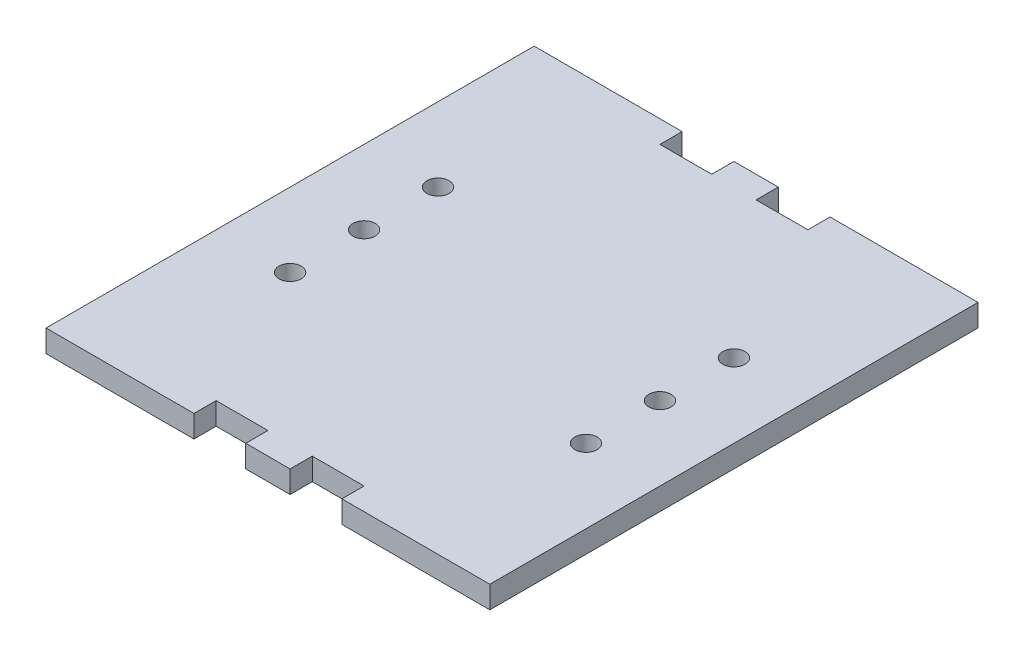
ISO-10303-21;
HEADER;
FILE_DESCRIPTION(('STEP AP214'),'2;1');
FILE_NAME('part.step','',(''),(''),'','','');
FILE_SCHEMA(('AUTOMOTIVE_DESIGN { 1 0 10303 214 1 1 1 1 }'));
ENDSEC;
DATA;
#1=APPLICATION_CONTEXT('core data for automotive mechanical design processes');
#2=APPLICATION_PROTOCOL_DEFINITION('international standard','automotive_design',2000,#1);
#3=PRODUCT_CONTEXT('',#1,'mechanical');
#4=PRODUCT('Part','Part','',(#3));
#5=PRODUCT_RELATED_PRODUCT_CATEGORY('part','',(#4));
#6=PRODUCT_DEFINITION_FORMATION('','',#4);
#7=PRODUCT_DEFINITION_CONTEXT('part definition',#1,'design');
#8=PRODUCT_DEFINITION('design','',#6,#7);
#9=PRODUCT_DEFINITION_SHAPE('','',#8);
#10=(LENGTH_UNIT() NAMED_UNIT(*) SI_UNIT(.MILLI.,.METRE.));
#11=(NAMED_UNIT(*) PLANE_ANGLE_UNIT() SI_UNIT($,.RADIAN.));
#12=(NAMED_UNIT(*) SI_UNIT($,.STERADIAN.) SOLID_ANGLE_UNIT());
#13=UNCERTAINTY_MEASURE_WITH_UNIT(LENGTH_MEASURE(1.E-05),#10,'distance_accuracy_value','');
#14=(GEOMETRIC_REPRESENTATION_CONTEXT(3) GLOBAL_UNCERTAINTY_ASSIGNED_CONTEXT((#13)) GLOBAL_UNIT_ASSIGNED_CONTEXT((#10,
#11,#12)) REPRESENTATION_CONTEXT('',''));
#15=CARTESIAN_POINT('',(0.,0.,0.));
#16=DIRECTION('',(0.,0.,1.));
#17=DIRECTION('',(1.,0.,0.));
#18=AXIS2_PLACEMENT_3D('',#15,#16,#17);
#19=CARTESIAN_POINT('',(0.,3.,0.));
#20=DIRECTION('',(0.,1.,0.));
#21=DIRECTION('',(0.,0.,1.));
#22=AXIS2_PLACEMENT_3D('',#19,#20,#21);
#23=PLANE('',#22);
#24=CARTESIAN_POINT('',(20.,3.,0.));
#25=DIRECTION('',(0.,1.,0.));
#26=DIRECTION('',(0.,0.,-1.));
#27=AXIS2_PLACEMENT_3D('',#24,#25,#26);
#28=CIRCLE('',#27,1.5);
#29=CARTESIAN_POINT('',(20.,3.,-1.5));
#30=VERTEX_POINT('',#29);
#31=EDGE_CURVE('E263',#30,#30,#28,.T.);
#32=ORIENTED_EDGE('',*,*,#31,.F.);
#33=EDGE_LOOP('',(#32));
#34=FACE_BOUND('',#33,.T.);
#35=CARTESIAN_POINT('',(-20.,3.,10.));
#36=DIRECTION('',(0.,1.,0.));
#37=DIRECTION('',(0.,0.,1.));
#38=AXIS2_PLACEMENT_3D('',#35,#36,#37);
#39=CIRCLE('',#38,1.5);
#40=CARTESIAN_POINT('',(-20.,3.,11.5));
#41=VERTEX_POINT('',#40);
#42=EDGE_CURVE('E247',#41,#41,#39,.T.);
#43=ORIENTED_EDGE('',*,*,#42,.F.);
#44=EDGE_LOOP('',(#43));
#45=FACE_BOUND('',#44,.T.);
#46=CARTESIAN_POINT('',(-20.,3.,0.));
#47=DIRECTION('',(0.,1.,0.));
#48=DIRECTION('',(0.,0.,1.));
#49=AXIS2_PLACEMENT_3D('',#46,#47,#48);
#50=CIRCLE('',#49,1.5);
#51=CARTESIAN_POINT('',(-20.,3.,1.5));
#52=VERTEX_POINT('',#51);
#53=EDGE_CURVE('E228',#52,#52,#50,.T.);
#54=ORIENTED_EDGE('',*,*,#53,.F.);
#55=EDGE_LOOP('',(#54));
#56=FACE_BOUND('',#55,.T.);
#57=CARTESIAN_POINT('',(-20.,3.,-9.99999999999999));
#58=DIRECTION('',(0.,1.,0.));
#59=DIRECTION('',(0.,0.,1.));
#60=AXIS2_PLACEMENT_3D('',#57,#58,#59);
#61=CIRCLE('',#60,1.5);
#62=CARTESIAN_POINT('',(-20.,3.,-8.49999999999999));
#63=VERTEX_POINT('',#62);
#64=EDGE_CURVE('E239',#63,#63,#61,.T.);
#65=ORIENTED_EDGE('',*,*,#64,.F.);
#66=EDGE_LOOP('',(#65));
#67=FACE_BOUND('',#66,.T.);
#68=CARTESIAN_POINT('',(20.,3.,10.));
#69=DIRECTION('',(0.,1.,0.));
#70=DIRECTION('',(0.,0.,-1.));
#71=AXIS2_PLACEMENT_3D('',#68,#69,#70);
#72=CIRCLE('',#71,1.5);
#73=CARTESIAN_POINT('',(20.,3.,8.50000000000001));
#74=VERTEX_POINT('',#73);
#75=EDGE_CURVE('E255',#74,#74,#72,.T.);
#76=ORIENTED_EDGE('',*,*,#75,.F.);
#77=EDGE_LOOP('',(#76));
#78=FACE_BOUND('',#77,.T.);
#79=CARTESIAN_POINT('',(20.,3.,-9.99999999999999));
#80=DIRECTION('',(0.,1.,0.));
#81=DIRECTION('',(0.,0.,-1.));
#82=AXIS2_PLACEMENT_3D('',#79,#80,#81);
#83=CIRCLE('',#82,1.5);
#84=CARTESIAN_POINT('',(20.,3.,-11.5));
#85=VERTEX_POINT('',#84);
#86=EDGE_CURVE('E271',#85,#85,#83,.T.);
#87=ORIENTED_EDGE('',*,*,#86,.F.);
#88=EDGE_LOOP('',(#87));
#89=FACE_BOUND('',#88,.T.);
#90=DIRECTION('',(-1.,0.,0.));
#91=VECTOR('',#90,1.);
#92=CARTESIAN_POINT('',(-3.,3.,-33.));
#93=LINE('',#92,#91);
#94=CARTESIAN_POINT('',(30.,3.,-33.));
#95=VERTEX_POINT('',#94);
#96=CARTESIAN_POINT('',(10.,3.,-33.));
#97=VERTEX_POINT('',#96);
#98=EDGE_CURVE('E214',#95,#97,#93,.T.);
#99=ORIENTED_EDGE('',*,*,#98,.T.);
#100=DIRECTION('',(0.,0.,1.));
#101=VECTOR('',#100,1.);
#102=CARTESIAN_POINT('',(10.,3.,0.));
#103=LINE('',#102,#101);
#104=CARTESIAN_POINT('',(10.,3.,-30.));
#105=VERTEX_POINT('',#104);
#106=EDGE_CURVE('E187',#97,#105,#103,.T.);
#107=ORIENTED_EDGE('',*,*,#106,.T.);
#108=DIRECTION('',(-1.,0.,0.));
#109=VECTOR('',#108,1.);
#110=CARTESIAN_POINT('',(0.,3.,-30.));
#111=LINE('',#110,#109);
#112=CARTESIAN_POINT('',(3.,3.,-30.));
#113=VERTEX_POINT('',#112);
#114=EDGE_CURVE('E201',#105,#113,#111,.T.);
#115=ORIENTED_EDGE('',*,*,#114,.T.);
#116=DIRECTION('',(0.,0.,-1.));
#117=VECTOR('',#116,1.);
#118=CARTESIAN_POINT('',(3.,3.,0.));
#119=LINE('',#118,#117);
#120=CARTESIAN_POINT('',(3.,3.,-33.));
#121=VERTEX_POINT('',#120);
#122=EDGE_CURVE('E434',#113,#121,#119,.T.);
#123=ORIENTED_EDGE('',*,*,#122,.T.);
#124=CARTESIAN_POINT('',(-3.,3.,-33.));
#125=VERTEX_POINT('',#124);
#126=EDGE_CURVE('E64',#121,#125,#93,.T.);
#127=ORIENTED_EDGE('',*,*,#126,.T.);
#128=DIRECTION('',(0.,0.,1.));
#129=VECTOR('',#128,1.);
#130=CARTESIAN_POINT('',(-3.,3.,0.));
#131=LINE('',#130,#129);
#132=CARTESIAN_POINT('',(-3.,3.,-30.));
#133=VERTEX_POINT('',#132);
#134=EDGE_CURVE('E409',#125,#133,#131,.T.);
#135=ORIENTED_EDGE('',*,*,#134,.T.);
#136=DIRECTION('',(-1.,0.,0.));
#137=VECTOR('',#136,1.);
#138=CARTESIAN_POINT('',(0.,3.,-30.));
#139=LINE('',#138,#137);
#140=CARTESIAN_POINT('',(-10.,3.,-30.));
#141=VERTEX_POINT('',#140);
#142=EDGE_CURVE('E412',#133,#141,#139,.T.);
#143=ORIENTED_EDGE('',*,*,#142,.T.);
#144=DIRECTION('',(0.,0.,-1.));
#145=VECTOR('',#144,1.);
#146=CARTESIAN_POINT('',(-10.,3.,0.));
#147=LINE('',#146,#145);
#148=CARTESIAN_POINT('',(-10.,3.,-33.));
#149=VERTEX_POINT('',#148);
#150=EDGE_CURVE('E404',#141,#149,#147,.T.);
#151=ORIENTED_EDGE('',*,*,#150,.T.);
#152=CARTESIAN_POINT('',(-30.,3.,-33.));
#153=VERTEX_POINT('',#152);
#154=EDGE_CURVE('E208',#149,#153,#93,.T.);
#155=ORIENTED_EDGE('',*,*,#154,.T.);
#156=DIRECTION('',(0.,0.,1.));
#157=VECTOR('',#156,1.);
#158=CARTESIAN_POINT('',(-30.,3.,-36.));
#159=LINE('',#158,#157);
#160=CARTESIAN_POINT('',(-30.,3.,33.));
#161=VERTEX_POINT('',#160);
#162=EDGE_CURVE('E48',#153,#161,#159,.T.);
#163=ORIENTED_EDGE('',*,*,#162,.T.);
#164=DIRECTION('',(-1.,0.,0.));
#165=VECTOR('',#164,1.);
#166=CARTESIAN_POINT('',(0.,3.,33.));
#167=LINE('',#166,#165);
#168=CARTESIAN_POINT('',(-10.,3.,33.));
#169=VERTEX_POINT('',#168);
#170=EDGE_CURVE('E318',#169,#161,#167,.T.);
#171=ORIENTED_EDGE('',*,*,#170,.F.);
#172=DIRECTION('',(0.,0.,1.));
#173=VECTOR('',#172,1.);
#174=CARTESIAN_POINT('',(-10.,3.,0.));
#175=LINE('',#174,#173);
#176=CARTESIAN_POINT('',(-10.,3.,30.));
#177=VERTEX_POINT('',#176);
#178=EDGE_CURVE('E322',#177,#169,#175,.T.);
#179=ORIENTED_EDGE('',*,*,#178,.F.);
#180=DIRECTION('',(-1.,0.,0.));
#181=VECTOR('',#180,1.);
#182=CARTESIAN_POINT('',(0.,3.,30.));
#183=LINE('',#182,#181);
#184=CARTESIAN_POINT('',(-3.,3.,30.));
#185=VERTEX_POINT('',#184);
#186=EDGE_CURVE('E326',#185,#177,#183,.T.);
#187=ORIENTED_EDGE('',*,*,#186,.F.);
#188=DIRECTION('',(0.,0.,-1.));
#189=VECTOR('',#188,1.);
#190=CARTESIAN_POINT('',(-3.,3.,0.));
#191=LINE('',#190,#189);
#192=CARTESIAN_POINT('',(-3.,3.,33.));
#193=VERTEX_POINT('',#192);
#194=EDGE_CURVE('E330',#193,#185,#191,.T.);
#195=ORIENTED_EDGE('',*,*,#194,.F.);
#196=DIRECTION('',(-1.,0.,0.));
#197=VECTOR('',#196,1.);
#198=CARTESIAN_POINT('',(0.,3.,33.));
#199=LINE('',#198,#197);
#200=CARTESIAN_POINT('',(3.,3.,33.));
#201=VERTEX_POINT('',#200);
#202=EDGE_CURVE('E334',#201,#193,#199,.T.);
#203=ORIENTED_EDGE('',*,*,#202,.F.);
#204=DIRECTION('',(0.,0.,1.));
#205=VECTOR('',#204,1.);
#206=CARTESIAN_POINT('',(3.,3.,0.));
#207=LINE('',#206,#205);
#208=CARTESIAN_POINT('',(3.,3.,30.));
#209=VERTEX_POINT('',#208);
#210=EDGE_CURVE('E338',#209,#201,#207,.T.);
#211=ORIENTED_EDGE('',*,*,#210,.F.);
#212=DIRECTION('',(-1.,0.,0.));
#213=VECTOR('',#212,1.);
#214=CARTESIAN_POINT('',(0.,3.,30.));
#215=LINE('',#214,#213);
#216=CARTESIAN_POINT('',(10.,3.,30.));
#217=VERTEX_POINT('',#216);
#218=EDGE_CURVE('E342',#217,#209,#215,.T.);
#219=ORIENTED_EDGE('',*,*,#218,.F.);
#220=DIRECTION('',(0.,0.,-1.));
#221=VECTOR('',#220,1.);
#222=CARTESIAN_POINT('',(10.,3.,0.));
#223=LINE('',#222,#221);
#224=CARTESIAN_POINT('',(10.,3.,33.));
#225=VERTEX_POINT('',#224);
#226=EDGE_CURVE('E346',#225,#217,#223,.T.);
#227=ORIENTED_EDGE('',*,*,#226,.F.);
#228=DIRECTION('',(-1.,0.,0.));
#229=VECTOR('',#228,1.);
#230=CARTESIAN_POINT('',(0.,3.,33.));
#231=LINE('',#230,#229);
#232=CARTESIAN_POINT('',(30.,3.,33.));
#233=VERTEX_POINT('',#232);
#234=EDGE_CURVE('E286',#233,#225,#231,.T.);
#235=ORIENTED_EDGE('',*,*,#234,.F.);
#236=DIRECTION('',(0.,0.,-1.));
#237=VECTOR('',#236,1.);
#238=CARTESIAN_POINT('',(30.,3.,-36.));
#239=LINE('',#238,#237);
#240=EDGE_CURVE('E11',#233,#95,#239,.T.);
#241=ORIENTED_EDGE('',*,*,#240,.T.);
#242=EDGE_LOOP('',(#99,#107,#115,#123,#127,#135,#143,#151,#155,#163,#171,#179,#187,#195,#203,
#211,#219,#227,#235,#241));
#243=FACE_BOUND('',#242,.T.);
#244=ADVANCED_FACE('F38',(#34,#45,#56,#67,#78,#89,#243),#23,.T.);
#245=CARTESIAN_POINT('',(0.,0.,0.));
#246=DIRECTION('',(0.,1.,0.));
#247=DIRECTION('',(0.,0.,1.));
#248=AXIS2_PLACEMENT_3D('',#245,#246,#247);
#249=PLANE('',#248);
#250=CARTESIAN_POINT('',(20.,0.,-9.99999999999999));
#251=DIRECTION('',(0.,1.,0.));
#252=DIRECTION('',(0.,0.,-1.));
#253=AXIS2_PLACEMENT_3D('',#250,#251,#252);
#254=CIRCLE('',#253,1.5);
#255=CARTESIAN_POINT('',(20.,0.,-11.5));
#256=VERTEX_POINT('',#255);
#257=EDGE_CURVE('E275',#256,#256,#254,.T.);
#258=ORIENTED_EDGE('',*,*,#257,.T.);
#259=EDGE_LOOP('',(#258));
#260=FACE_BOUND('',#259,.T.);
#261=CARTESIAN_POINT('',(20.,0.,0.));
#262=DIRECTION('',(0.,1.,0.));
#263=DIRECTION('',(0.,0.,-1.));
#264=AXIS2_PLACEMENT_3D('',#261,#262,#263);
#265=CIRCLE('',#264,1.5);
#266=CARTESIAN_POINT('',(20.,0.,-1.5));
#267=VERTEX_POINT('',#266);
#268=EDGE_CURVE('E267',#267,#267,#265,.T.);
#269=ORIENTED_EDGE('',*,*,#268,.T.);
#270=EDGE_LOOP('',(#269));
#271=FACE_BOUND('',#270,.T.);
#272=CARTESIAN_POINT('',(20.,0.,10.));
#273=DIRECTION('',(0.,1.,0.));
#274=DIRECTION('',(0.,0.,-1.));
#275=AXIS2_PLACEMENT_3D('',#272,#273,#274);
#276=CIRCLE('',#275,1.5);
#277=CARTESIAN_POINT('',(20.,0.,8.50000000000001));
#278=VERTEX_POINT('',#277);
#279=EDGE_CURVE('E259',#278,#278,#276,.T.);
#280=ORIENTED_EDGE('',*,*,#279,.T.);
#281=EDGE_LOOP('',(#280));
#282=FACE_BOUND('',#281,.T.);
#283=CARTESIAN_POINT('',(-20.,0.,10.));
#284=DIRECTION('',(0.,1.,0.));
#285=DIRECTION('',(0.,0.,1.));
#286=AXIS2_PLACEMENT_3D('',#283,#284,#285);
#287=CIRCLE('',#286,1.5);
#288=CARTESIAN_POINT('',(-20.,0.,11.5));
#289=VERTEX_POINT('',#288);
#290=EDGE_CURVE('E251',#289,#289,#287,.T.);
#291=ORIENTED_EDGE('',*,*,#290,.T.);
#292=EDGE_LOOP('',(#291));
#293=FACE_BOUND('',#292,.T.);
#294=CARTESIAN_POINT('',(-20.,0.,-9.99999999999999));
#295=DIRECTION('',(0.,1.,0.));
#296=DIRECTION('',(0.,0.,1.));
#297=AXIS2_PLACEMENT_3D('',#294,#295,#296);
#298=CIRCLE('',#297,1.5);
#299=CARTESIAN_POINT('',(-20.,0.,-8.49999999999999));
#300=VERTEX_POINT('',#299);
#301=EDGE_CURVE('E243',#300,#300,#298,.T.);
#302=ORIENTED_EDGE('',*,*,#301,.T.);
#303=EDGE_LOOP('',(#302));
#304=FACE_BOUND('',#303,.T.);
#305=CARTESIAN_POINT('',(-20.,0.,0.));
#306=DIRECTION('',(0.,1.,0.));
#307=DIRECTION('',(0.,0.,1.));
#308=AXIS2_PLACEMENT_3D('',#305,#306,#307);
#309=CIRCLE('',#308,1.5);
#310=CARTESIAN_POINT('',(-20.,0.,1.5));
#311=VERTEX_POINT('',#310);
#312=EDGE_CURVE('E235',#311,#311,#309,.T.);
#313=ORIENTED_EDGE('',*,*,#312,.T.);
#314=EDGE_LOOP('',(#313));
#315=FACE_BOUND('',#314,.T.);
#316=DIRECTION('',(0.,0.,1.));
#317=VECTOR('',#316,1.);
#318=CARTESIAN_POINT('',(10.,0.,0.));
#319=LINE('',#318,#317);
#320=CARTESIAN_POINT('',(10.,0.,-33.));
#321=VERTEX_POINT('',#320);
#322=CARTESIAN_POINT('',(10.,0.,-30.));
#323=VERTEX_POINT('',#322);
#324=EDGE_CURVE('E184',#321,#323,#319,.T.);
#325=ORIENTED_EDGE('',*,*,#324,.F.);
#326=DIRECTION('',(-1.,0.,0.));
#327=VECTOR('',#326,1.);
#328=CARTESIAN_POINT('',(3.,0.,-33.));
#329=LINE('',#328,#327);
#330=CARTESIAN_POINT('',(30.,0.,-33.));
#331=VERTEX_POINT('',#330);
#332=EDGE_CURVE('E42',#331,#321,#329,.T.);
#333=ORIENTED_EDGE('',*,*,#332,.F.);
#334=DIRECTION('',(0.,0.,-1.));
#335=VECTOR('',#334,1.);
#336=CARTESIAN_POINT('',(30.,0.,-36.));
#337=LINE('',#336,#335);
#338=CARTESIAN_POINT('',(30.,0.,33.));
#339=VERTEX_POINT('',#338);
#340=EDGE_CURVE('E216',#339,#331,#337,.T.);
#341=ORIENTED_EDGE('',*,*,#340,.F.);
#342=DIRECTION('',(-1.,0.,0.));
#343=VECTOR('',#342,1.);
#344=CARTESIAN_POINT('',(0.,0.,33.));
#345=LINE('',#344,#343);
#346=CARTESIAN_POINT('',(10.,0.,33.));
#347=VERTEX_POINT('',#346);
#348=EDGE_CURVE('E321',#339,#347,#345,.T.);
#349=ORIENTED_EDGE('',*,*,#348,.T.);
#350=DIRECTION('',(0.,0.,-1.));
#351=VECTOR('',#350,1.);
#352=CARTESIAN_POINT('',(10.,0.,0.));
#353=LINE('',#352,#351);
#354=CARTESIAN_POINT('',(10.,0.,30.));
#355=VERTEX_POINT('',#354);
#356=EDGE_CURVE('E380',#347,#355,#353,.T.);
#357=ORIENTED_EDGE('',*,*,#356,.T.);
#358=DIRECTION('',(-1.,0.,0.));
#359=VECTOR('',#358,1.);
#360=CARTESIAN_POINT('',(0.,0.,30.));
#361=LINE('',#360,#359);
#362=CARTESIAN_POINT('',(3.,0.,30.));
#363=VERTEX_POINT('',#362);
#364=EDGE_CURVE('E376',#355,#363,#361,.T.);
#365=ORIENTED_EDGE('',*,*,#364,.T.);
#366=DIRECTION('',(0.,0.,1.));
#367=VECTOR('',#366,1.);
#368=CARTESIAN_POINT('',(3.,0.,0.));
#369=LINE('',#368,#367);
#370=CARTESIAN_POINT('',(3.,0.,33.));
#371=VERTEX_POINT('',#370);
#372=EDGE_CURVE('E372',#363,#371,#369,.T.);
#373=ORIENTED_EDGE('',*,*,#372,.T.);
#374=DIRECTION('',(-1.,0.,0.));
#375=VECTOR('',#374,1.);
#376=CARTESIAN_POINT('',(0.,0.,33.));
#377=LINE('',#376,#375);
#378=CARTESIAN_POINT('',(-3.,0.,33.));
#379=VERTEX_POINT('',#378);
#380=EDGE_CURVE('E368',#371,#379,#377,.T.);
#381=ORIENTED_EDGE('',*,*,#380,.T.);
#382=DIRECTION('',(0.,0.,-1.));
#383=VECTOR('',#382,1.);
#384=CARTESIAN_POINT('',(-3.,0.,0.));
#385=LINE('',#384,#383);
#386=CARTESIAN_POINT('',(-3.,0.,30.));
#387=VERTEX_POINT('',#386);
#388=EDGE_CURVE('E364',#379,#387,#385,.T.);
#389=ORIENTED_EDGE('',*,*,#388,.T.);
#390=DIRECTION('',(-1.,0.,0.));
#391=VECTOR('',#390,1.);
#392=CARTESIAN_POINT('',(0.,0.,30.));
#393=LINE('',#392,#391);
#394=CARTESIAN_POINT('',(-10.,0.,30.));
#395=VERTEX_POINT('',#394);
#396=EDGE_CURVE('E360',#387,#395,#393,.T.);
#397=ORIENTED_EDGE('',*,*,#396,.T.);
#398=DIRECTION('',(0.,0.,1.));
#399=VECTOR('',#398,1.);
#400=CARTESIAN_POINT('',(-10.,0.,0.));
#401=LINE('',#400,#399);
#402=CARTESIAN_POINT('',(-10.,0.,33.));
#403=VERTEX_POINT('',#402);
#404=EDGE_CURVE('E356',#395,#403,#401,.T.);
#405=ORIENTED_EDGE('',*,*,#404,.T.);
#406=DIRECTION('',(-1.,0.,0.));
#407=VECTOR('',#406,1.);
#408=CARTESIAN_POINT('',(0.,0.,33.));
#409=LINE('',#408,#407);
#410=CARTESIAN_POINT('',(-30.,0.,33.));
#411=VERTEX_POINT('',#410);
#412=EDGE_CURVE('E291',#403,#411,#409,.T.);
#413=ORIENTED_EDGE('',*,*,#412,.T.);
#414=DIRECTION('',(0.,0.,1.));
#415=VECTOR('',#414,1.);
#416=CARTESIAN_POINT('',(-30.,0.,-36.));
#417=LINE('',#416,#415);
#418=CARTESIAN_POINT('',(-30.,0.,-33.));
#419=VERTEX_POINT('',#418);
#420=EDGE_CURVE('E223',#419,#411,#417,.T.);
#421=ORIENTED_EDGE('',*,*,#420,.F.);
#422=CARTESIAN_POINT('',(-10.,0.,-33.));
#423=VERTEX_POINT('',#422);
#424=EDGE_CURVE('E210',#423,#419,#329,.T.);
#425=ORIENTED_EDGE('',*,*,#424,.F.);
#426=DIRECTION('',(0.,0.,-1.));
#427=VECTOR('',#426,1.);
#428=CARTESIAN_POINT('',(-10.,0.,0.));
#429=LINE('',#428,#427);
#430=CARTESIAN_POINT('',(-10.,0.,-30.));
#431=VERTEX_POINT('',#430);
#432=EDGE_CURVE('E394',#431,#423,#429,.T.);
#433=ORIENTED_EDGE('',*,*,#432,.F.);
#434=DIRECTION('',(-1.,0.,0.));
#435=VECTOR('',#434,1.);
#436=CARTESIAN_POINT('',(0.,0.,-30.));
#437=LINE('',#436,#435);
#438=CARTESIAN_POINT('',(-3.,0.,-30.));
#439=VERTEX_POINT('',#438);
#440=EDGE_CURVE('E408',#439,#431,#437,.T.);
#441=ORIENTED_EDGE('',*,*,#440,.F.);
#442=DIRECTION('',(0.,0.,1.));
#443=VECTOR('',#442,1.);
#444=CARTESIAN_POINT('',(-3.,0.,0.));
#445=LINE('',#444,#443);
#446=CARTESIAN_POINT('',(-3.,0.,-33.));
#447=VERTEX_POINT('',#446);
#448=EDGE_CURVE('E419',#447,#439,#445,.T.);
#449=ORIENTED_EDGE('',*,*,#448,.F.);
#450=CARTESIAN_POINT('',(3.,0.,-33.));
#451=VERTEX_POINT('',#450);
#452=EDGE_CURVE('E209',#451,#447,#329,.T.);
#453=ORIENTED_EDGE('',*,*,#452,.F.);
#454=DIRECTION('',(0.,0.,-1.));
#455=VECTOR('',#454,1.);
#456=CARTESIAN_POINT('',(3.,0.,0.));
#457=LINE('',#456,#455);
#458=CARTESIAN_POINT('',(3.,0.,-30.));
#459=VERTEX_POINT('',#458);
#460=EDGE_CURVE('E56',#459,#451,#457,.T.);
#461=ORIENTED_EDGE('',*,*,#460,.F.);
#462=DIRECTION('',(-1.,0.,0.));
#463=VECTOR('',#462,1.);
#464=CARTESIAN_POINT('',(0.,0.,-30.));
#465=LINE('',#464,#463);
#466=EDGE_CURVE('E193',#323,#459,#465,.T.);
#467=ORIENTED_EDGE('',*,*,#466,.F.);
#468=EDGE_LOOP('',(#325,#333,#341,#349,#357,#365,#373,#381,#389,#397,#405,#413,#421,#425,#433,
#441,#449,#453,#461,#467));
#469=FACE_BOUND('',#468,.T.);
#470=ADVANCED_FACE('F197',(#260,#271,#282,#293,#304,#315,#469),#249,.F.);
#471=CARTESIAN_POINT('',(3.,3.,-33.));
#472=DIRECTION('',(0.,0.,1.));
#473=DIRECTION('',(1.,0.,0.));
#474=AXIS2_PLACEMENT_3D('',#471,#472,#473);
#475=PLANE('',#474);
#476=DIRECTION('',(0.,1.,0.));
#477=VECTOR('',#476,1.);
#478=CARTESIAN_POINT('',(10.,0.,-33.));
#479=LINE('',#478,#477);
#480=EDGE_CURVE('E180',#321,#97,#479,.T.);
#481=ORIENTED_EDGE('',*,*,#480,.T.);
#482=ORIENTED_EDGE('',*,*,#98,.F.);
#483=DIRECTION('',(0.,1.,0.));
#484=VECTOR('',#483,1.);
#485=CARTESIAN_POINT('',(30.,0.,-33.));
#486=LINE('',#485,#484);
#487=EDGE_CURVE('E205',#331,#95,#486,.T.);
#488=ORIENTED_EDGE('',*,*,#487,.F.);
#489=ORIENTED_EDGE('',*,*,#332,.T.);
#490=EDGE_LOOP('',(#481,#482,#488,#489));
#491=FACE_BOUND('',#490,.T.);
#492=ADVANCED_FACE('F203',(#491),#475,.F.);
#493=DIRECTION('',(0.,1.,0.));
#494=VECTOR('',#493,1.);
#495=CARTESIAN_POINT('',(3.,0.,-33.));
#496=LINE('',#495,#494);
#497=EDGE_CURVE('E192',#451,#121,#496,.T.);
#498=ORIENTED_EDGE('',*,*,#497,.F.);
#499=ORIENTED_EDGE('',*,*,#452,.T.);
#500=DIRECTION('',(0.,1.,0.));
#501=VECTOR('',#500,1.);
#502=CARTESIAN_POINT('',(-3.,0.,-33.));
#503=LINE('',#502,#501);
#504=EDGE_CURVE('E393',#447,#125,#503,.T.);
#505=ORIENTED_EDGE('',*,*,#504,.T.);
#506=ORIENTED_EDGE('',*,*,#126,.F.);
#507=EDGE_LOOP('',(#498,#499,#505,#506));
#508=FACE_BOUND('',#507,.T.);
#509=ADVANCED_FACE('F451',(#508),#475,.F.);
#510=DIRECTION('',(0.,1.,0.));
#511=VECTOR('',#510,1.);
#512=CARTESIAN_POINT('',(-10.,0.,-33.));
#513=LINE('',#512,#511);
#514=EDGE_CURVE('E398',#423,#149,#513,.T.);
#515=ORIENTED_EDGE('',*,*,#514,.F.);
#516=ORIENTED_EDGE('',*,*,#424,.T.);
#517=DIRECTION('',(0.,1.,0.));
#518=VECTOR('',#517,1.);
#519=CARTESIAN_POINT('',(-30.,0.,-33.));
#520=LINE('',#519,#518);
#521=EDGE_CURVE('E283',#419,#153,#520,.T.);
#522=ORIENTED_EDGE('',*,*,#521,.T.);
#523=ORIENTED_EDGE('',*,*,#154,.F.);
#524=EDGE_LOOP('',(#515,#516,#522,#523));
#525=FACE_BOUND('',#524,.T.);
#526=ADVANCED_FACE('F467',(#525),#475,.F.);
#527=CARTESIAN_POINT('',(-30.,3.,-36.));
#528=DIRECTION('',(1.,0.,0.));
#529=DIRECTION('',(0.,0.,-1.));
#530=AXIS2_PLACEMENT_3D('',#527,#528,#529);
#531=PLANE('',#530);
#532=ORIENTED_EDGE('',*,*,#420,.T.);
#533=DIRECTION('',(0.,1.,0.));
#534=VECTOR('',#533,1.);
#535=CARTESIAN_POINT('',(-30.,0.,33.));
#536=LINE('',#535,#534);
#537=EDGE_CURVE('E279',#411,#161,#536,.T.);
#538=ORIENTED_EDGE('',*,*,#537,.T.);
#539=ORIENTED_EDGE('',*,*,#162,.F.);
#540=ORIENTED_EDGE('',*,*,#521,.F.);
#541=EDGE_LOOP('',(#532,#538,#539,#540));
#542=FACE_BOUND('',#541,.T.);
#543=ADVANCED_FACE('F40',(#542),#531,.F.);
#544=CARTESIAN_POINT('',(30.,3.,-36.));
#545=DIRECTION('',(-1.,0.,0.));
#546=DIRECTION('',(0.,0.,1.));
#547=AXIS2_PLACEMENT_3D('',#544,#545,#546);
#548=PLANE('',#547);
#549=ORIENTED_EDGE('',*,*,#487,.T.);
#550=ORIENTED_EDGE('',*,*,#240,.F.);
#551=DIRECTION('',(0.,1.,0.));
#552=VECTOR('',#551,1.);
#553=CARTESIAN_POINT('',(30.,0.,33.));
#554=LINE('',#553,#552);
#555=EDGE_CURVE('E287',#339,#233,#554,.T.);
#556=ORIENTED_EDGE('',*,*,#555,.F.);
#557=ORIENTED_EDGE('',*,*,#340,.T.);
#558=EDGE_LOOP('',(#549,#550,#556,#557));
#559=FACE_BOUND('',#558,.T.);
#560=ADVANCED_FACE('F503',(#559),#548,.F.);
#561=CARTESIAN_POINT('',(-20.,3.,0.));
#562=DIRECTION('',(0.,-1.,0.));
#563=DIRECTION('',(0.,0.,-1.));
#564=AXIS2_PLACEMENT_3D('',#561,#562,#563);
#565=CYLINDRICAL_SURFACE('',#564,1.5);
#566=ORIENTED_EDGE('',*,*,#53,.T.);
#567=EDGE_LOOP('',(#566));
#568=FACE_BOUND('',#567,.T.);
#569=ORIENTED_EDGE('',*,*,#312,.F.);
#570=EDGE_LOOP('',(#569));
#571=FACE_BOUND('',#570,.T.);
#572=ADVANCED_FACE('F505',(#568,#571),#565,.F.);
#573=CARTESIAN_POINT('',(-20.,3.,-9.99999999999999));
#574=DIRECTION('',(0.,-1.,0.));
#575=DIRECTION('',(0.,0.,-1.));
#576=AXIS2_PLACEMENT_3D('',#573,#574,#575);
#577=CYLINDRICAL_SURFACE('',#576,1.5);
#578=ORIENTED_EDGE('',*,*,#64,.T.);
#579=EDGE_LOOP('',(#578));
#580=FACE_BOUND('',#579,.T.);
#581=ORIENTED_EDGE('',*,*,#301,.F.);
#582=EDGE_LOOP('',(#581));
#583=FACE_BOUND('',#582,.T.);
#584=ADVANCED_FACE('F511',(#580,#583),#577,.F.);
#585=CARTESIAN_POINT('',(-20.,3.,10.));
#586=DIRECTION('',(0.,-1.,0.));
#587=DIRECTION('',(0.,0.,-1.));
#588=AXIS2_PLACEMENT_3D('',#585,#586,#587);
#589=CYLINDRICAL_SURFACE('',#588,1.5);
#590=ORIENTED_EDGE('',*,*,#42,.T.);
#591=EDGE_LOOP('',(#590));
#592=FACE_BOUND('',#591,.T.);
#593=ORIENTED_EDGE('',*,*,#290,.F.);
#594=EDGE_LOOP('',(#593));
#595=FACE_BOUND('',#594,.T.);
#596=ADVANCED_FACE('F630',(#592,#595),#589,.F.);
#597=CARTESIAN_POINT('',(20.,3.,10.));
#598=DIRECTION('',(0.,-1.,0.));
#599=DIRECTION('',(0.,0.,-1.));
#600=AXIS2_PLACEMENT_3D('',#597,#598,#599);
#601=CYLINDRICAL_SURFACE('',#600,1.5);
#602=ORIENTED_EDGE('',*,*,#75,.T.);
#603=EDGE_LOOP('',(#602));
#604=FACE_BOUND('',#603,.T.);
#605=ORIENTED_EDGE('',*,*,#279,.F.);
#606=EDGE_LOOP('',(#605));
#607=FACE_BOUND('',#606,.T.);
#608=ADVANCED_FACE('F621',(#604,#607),#601,.F.);
#609=CARTESIAN_POINT('',(20.,3.,0.));
#610=DIRECTION('',(0.,-1.,0.));
#611=DIRECTION('',(0.,0.,-1.));
#612=AXIS2_PLACEMENT_3D('',#609,#610,#611);
#613=CYLINDRICAL_SURFACE('',#612,1.5);
#614=ORIENTED_EDGE('',*,*,#31,.T.);
#615=EDGE_LOOP('',(#614));
#616=FACE_BOUND('',#615,.T.);
#617=ORIENTED_EDGE('',*,*,#268,.F.);
#618=EDGE_LOOP('',(#617));
#619=FACE_BOUND('',#618,.T.);
#620=ADVANCED_FACE('F612',(#616,#619),#613,.F.);
#621=CARTESIAN_POINT('',(20.,3.,-9.99999999999999));
#622=DIRECTION('',(0.,-1.,0.));
#623=DIRECTION('',(0.,0.,-1.));
#624=AXIS2_PLACEMENT_3D('',#621,#622,#623);
#625=CYLINDRICAL_SURFACE('',#624,1.5);
#626=ORIENTED_EDGE('',*,*,#86,.T.);
#627=EDGE_LOOP('',(#626));
#628=FACE_BOUND('',#627,.T.);
#629=ORIENTED_EDGE('',*,*,#257,.F.);
#630=EDGE_LOOP('',(#629));
#631=FACE_BOUND('',#630,.T.);
#632=ADVANCED_FACE('F608',(#628,#631),#625,.F.);
#633=CARTESIAN_POINT('',(0.,0.,33.));
#634=DIRECTION('',(0.,0.,-1.));
#635=DIRECTION('',(-1.,0.,0.));
#636=AXIS2_PLACEMENT_3D('',#633,#634,#635);
#637=PLANE('',#636);
#638=ORIENTED_EDGE('',*,*,#170,.T.);
#639=ORIENTED_EDGE('',*,*,#537,.F.);
#640=ORIENTED_EDGE('',*,*,#412,.F.);
#641=DIRECTION('',(0.,1.,0.));
#642=VECTOR('',#641,1.);
#643=CARTESIAN_POINT('',(-10.,0.,33.));
#644=LINE('',#643,#642);
#645=EDGE_CURVE('E312',#403,#169,#644,.T.);
#646=ORIENTED_EDGE('',*,*,#645,.T.);
#647=EDGE_LOOP('',(#638,#639,#640,#646));
#648=FACE_BOUND('',#647,.T.);
#649=ADVANCED_FACE('F472',(#648),#637,.F.);
#650=CARTESIAN_POINT('',(-10.,0.,0.));
#651=DIRECTION('',(-1.,0.,0.));
#652=DIRECTION('',(0.,0.,1.));
#653=AXIS2_PLACEMENT_3D('',#650,#651,#652);
#654=PLANE('',#653);
#655=ORIENTED_EDGE('',*,*,#178,.T.);
#656=ORIENTED_EDGE('',*,*,#645,.F.);
#657=ORIENTED_EDGE('',*,*,#404,.F.);
#658=DIRECTION('',(0.,1.,0.));
#659=VECTOR('',#658,1.);
#660=CARTESIAN_POINT('',(-10.,0.,30.));
#661=LINE('',#660,#659);
#662=EDGE_CURVE('E309',#395,#177,#661,.T.);
#663=ORIENTED_EDGE('',*,*,#662,.T.);
#664=EDGE_LOOP('',(#655,#656,#657,#663));
#665=FACE_BOUND('',#664,.T.);
#666=ADVANCED_FACE('F475',(#665),#654,.F.);
#667=CARTESIAN_POINT('',(0.,0.,30.));
#668=DIRECTION('',(0.,0.,-1.));
#669=DIRECTION('',(-1.,0.,0.));
#670=AXIS2_PLACEMENT_3D('',#667,#668,#669);
#671=PLANE('',#670);
#672=ORIENTED_EDGE('',*,*,#186,.T.);
#673=ORIENTED_EDGE('',*,*,#662,.F.);
#674=ORIENTED_EDGE('',*,*,#396,.F.);
#675=DIRECTION('',(0.,1.,0.));
#676=VECTOR('',#675,1.);
#677=CARTESIAN_POINT('',(-3.,0.,30.));
#678=LINE('',#677,#676);
#679=EDGE_CURVE('E306',#387,#185,#678,.T.);
#680=ORIENTED_EDGE('',*,*,#679,.T.);
#681=EDGE_LOOP('',(#672,#673,#674,#680));
#682=FACE_BOUND('',#681,.T.);
#683=ADVANCED_FACE('F478',(#682),#671,.F.);
#684=CARTESIAN_POINT('',(-3.,0.,0.));
#685=DIRECTION('',(1.,0.,0.));
#686=DIRECTION('',(0.,0.,-1.));
#687=AXIS2_PLACEMENT_3D('',#684,#685,#686);
#688=PLANE('',#687);
#689=ORIENTED_EDGE('',*,*,#194,.T.);
#690=ORIENTED_EDGE('',*,*,#679,.F.);
#691=ORIENTED_EDGE('',*,*,#388,.F.);
#692=DIRECTION('',(0.,1.,0.));
#693=VECTOR('',#692,1.);
#694=CARTESIAN_POINT('',(-3.,0.,33.));
#695=LINE('',#694,#693);
#696=EDGE_CURVE('E303',#379,#193,#695,.T.);
#697=ORIENTED_EDGE('',*,*,#696,.T.);
#698=EDGE_LOOP('',(#689,#690,#691,#697));
#699=FACE_BOUND('',#698,.T.);
#700=ADVANCED_FACE('F483',(#699),#688,.F.);
#701=CARTESIAN_POINT('',(0.,0.,33.));
#702=DIRECTION('',(0.,0.,-1.));
#703=DIRECTION('',(-1.,0.,0.));
#704=AXIS2_PLACEMENT_3D('',#701,#702,#703);
#705=PLANE('',#704);
#706=ORIENTED_EDGE('',*,*,#202,.T.);
#707=ORIENTED_EDGE('',*,*,#696,.F.);
#708=ORIENTED_EDGE('',*,*,#380,.F.);
#709=DIRECTION('',(0.,1.,0.));
#710=VECTOR('',#709,1.);
#711=CARTESIAN_POINT('',(3.,0.,33.));
#712=LINE('',#711,#710);
#713=EDGE_CURVE('E300',#371,#201,#712,.T.);
#714=ORIENTED_EDGE('',*,*,#713,.T.);
#715=EDGE_LOOP('',(#706,#707,#708,#714));
#716=FACE_BOUND('',#715,.T.);
#717=ADVANCED_FACE('F487',(#716),#705,.F.);
#718=CARTESIAN_POINT('',(3.,0.,0.));
#719=DIRECTION('',(-1.,0.,0.));
#720=DIRECTION('',(0.,0.,1.));
#721=AXIS2_PLACEMENT_3D('',#718,#719,#720);
#722=PLANE('',#721);
#723=ORIENTED_EDGE('',*,*,#210,.T.);
#724=ORIENTED_EDGE('',*,*,#713,.F.);
#725=ORIENTED_EDGE('',*,*,#372,.F.);
#726=DIRECTION('',(0.,1.,0.));
#727=VECTOR('',#726,1.);
#728=CARTESIAN_POINT('',(3.,0.,30.));
#729=LINE('',#728,#727);
#730=EDGE_CURVE('E297',#363,#209,#729,.T.);
#731=ORIENTED_EDGE('',*,*,#730,.T.);
#732=EDGE_LOOP('',(#723,#724,#725,#731));
#733=FACE_BOUND('',#732,.T.);
#734=ADVANCED_FACE('F490',(#733),#722,.F.);
#735=CARTESIAN_POINT('',(0.,0.,30.));
#736=DIRECTION('',(0.,0.,-1.));
#737=DIRECTION('',(-1.,0.,0.));
#738=AXIS2_PLACEMENT_3D('',#735,#736,#737);
#739=PLANE('',#738);
#740=ORIENTED_EDGE('',*,*,#218,.T.);
#741=ORIENTED_EDGE('',*,*,#730,.F.);
#742=ORIENTED_EDGE('',*,*,#364,.F.);
#743=DIRECTION('',(0.,1.,0.));
#744=VECTOR('',#743,1.);
#745=CARTESIAN_POINT('',(10.,0.,30.));
#746=LINE('',#745,#744);
#747=EDGE_CURVE('E294',#355,#217,#746,.T.);
#748=ORIENTED_EDGE('',*,*,#747,.T.);
#749=EDGE_LOOP('',(#740,#741,#742,#748));
#750=FACE_BOUND('',#749,.T.);
#751=ADVANCED_FACE('F495',(#750),#739,.F.);
#752=CARTESIAN_POINT('',(10.,0.,0.));
#753=DIRECTION('',(1.,0.,0.));
#754=DIRECTION('',(0.,0.,-1.));
#755=AXIS2_PLACEMENT_3D('',#752,#753,#754);
#756=PLANE('',#755);
#757=ORIENTED_EDGE('',*,*,#226,.T.);
#758=ORIENTED_EDGE('',*,*,#747,.F.);
#759=ORIENTED_EDGE('',*,*,#356,.F.);
#760=DIRECTION('',(0.,1.,0.));
#761=VECTOR('',#760,1.);
#762=CARTESIAN_POINT('',(10.,0.,33.));
#763=LINE('',#762,#761);
#764=EDGE_CURVE('E290',#347,#225,#763,.T.);
#765=ORIENTED_EDGE('',*,*,#764,.T.);
#766=EDGE_LOOP('',(#757,#758,#759,#765));
#767=FACE_BOUND('',#766,.T.);
#768=ADVANCED_FACE('F499',(#767),#756,.F.);
#769=CARTESIAN_POINT('',(0.,0.,33.));
#770=DIRECTION('',(0.,0.,-1.));
#771=DIRECTION('',(-1.,0.,0.));
#772=AXIS2_PLACEMENT_3D('',#769,#770,#771);
#773=PLANE('',#772);
#774=ORIENTED_EDGE('',*,*,#234,.T.);
#775=ORIENTED_EDGE('',*,*,#764,.F.);
#776=ORIENTED_EDGE('',*,*,#348,.F.);
#777=ORIENTED_EDGE('',*,*,#555,.T.);
#778=EDGE_LOOP('',(#774,#775,#776,#777));
#779=FACE_BOUND('',#778,.T.);
#780=ADVANCED_FACE('F501',(#779),#773,.F.);
#781=CARTESIAN_POINT('',(0.,0.,-30.));
#782=DIRECTION('',(0.,0.,-1.));
#783=DIRECTION('',(-1.,0.,0.));
#784=AXIS2_PLACEMENT_3D('',#781,#782,#783);
#785=PLANE('',#784);
#786=ORIENTED_EDGE('',*,*,#142,.F.);
#787=DIRECTION('',(0.,1.,0.));
#788=VECTOR('',#787,1.);
#789=CARTESIAN_POINT('',(-3.,0.,-30.));
#790=LINE('',#789,#788);
#791=EDGE_CURVE('E390',#439,#133,#790,.T.);
#792=ORIENTED_EDGE('',*,*,#791,.F.);
#793=ORIENTED_EDGE('',*,*,#440,.T.);
#794=DIRECTION('',(0.,1.,0.));
#795=VECTOR('',#794,1.);
#796=CARTESIAN_POINT('',(-10.,0.,-30.));
#797=LINE('',#796,#795);
#798=EDGE_CURVE('E389',#431,#141,#797,.T.);
#799=ORIENTED_EDGE('',*,*,#798,.T.);
#800=EDGE_LOOP('',(#786,#792,#793,#799));
#801=FACE_BOUND('',#800,.T.);
#802=ADVANCED_FACE('F458',(#801),#785,.T.);
#803=CARTESIAN_POINT('',(-10.,0.,0.));
#804=DIRECTION('',(1.,0.,0.));
#805=DIRECTION('',(0.,0.,-1.));
#806=AXIS2_PLACEMENT_3D('',#803,#804,#805);
#807=PLANE('',#806);
#808=ORIENTED_EDGE('',*,*,#150,.F.);
#809=ORIENTED_EDGE('',*,*,#798,.F.);
#810=ORIENTED_EDGE('',*,*,#432,.T.);
#811=ORIENTED_EDGE('',*,*,#514,.T.);
#812=EDGE_LOOP('',(#808,#809,#810,#811));
#813=FACE_BOUND('',#812,.T.);
#814=ADVANCED_FACE('F462',(#813),#807,.T.);
#815=CARTESIAN_POINT('',(-3.,0.,0.));
#816=DIRECTION('',(-1.,0.,0.));
#817=DIRECTION('',(0.,0.,1.));
#818=AXIS2_PLACEMENT_3D('',#815,#816,#817);
#819=PLANE('',#818);
#820=ORIENTED_EDGE('',*,*,#134,.F.);
#821=ORIENTED_EDGE('',*,*,#504,.F.);
#822=ORIENTED_EDGE('',*,*,#448,.T.);
#823=ORIENTED_EDGE('',*,*,#791,.T.);
#824=EDGE_LOOP('',(#820,#821,#822,#823));
#825=FACE_BOUND('',#824,.T.);
#826=ADVANCED_FACE('F453',(#825),#819,.T.);
#827=CARTESIAN_POINT('',(10.,0.,0.));
#828=DIRECTION('',(-1.,0.,0.));
#829=DIRECTION('',(0.,0.,1.));
#830=AXIS2_PLACEMENT_3D('',#827,#828,#829);
#831=PLANE('',#830);
#832=ORIENTED_EDGE('',*,*,#106,.F.);
#833=ORIENTED_EDGE('',*,*,#480,.F.);
#834=ORIENTED_EDGE('',*,*,#324,.T.);
#835=DIRECTION('',(0.,1.,0.));
#836=VECTOR('',#835,1.);
#837=CARTESIAN_POINT('',(10.,0.,-30.));
#838=LINE('',#837,#836);
#839=EDGE_CURVE('E416',#323,#105,#838,.T.);
#840=ORIENTED_EDGE('',*,*,#839,.T.);
#841=EDGE_LOOP('',(#832,#833,#834,#840));
#842=FACE_BOUND('',#841,.T.);
#843=ADVANCED_FACE('F182',(#842),#831,.T.);
#844=CARTESIAN_POINT('',(0.,0.,-30.));
#845=DIRECTION('',(0.,0.,-1.));
#846=DIRECTION('',(-1.,0.,0.));
#847=AXIS2_PLACEMENT_3D('',#844,#845,#846);
#848=PLANE('',#847);
#849=ORIENTED_EDGE('',*,*,#114,.F.);
#850=ORIENTED_EDGE('',*,*,#839,.F.);
#851=ORIENTED_EDGE('',*,*,#466,.T.);
#852=DIRECTION('',(0.,1.,0.));
#853=VECTOR('',#852,1.);
#854=CARTESIAN_POINT('',(3.,0.,-30.));
#855=LINE('',#854,#853);
#856=EDGE_CURVE('E426',#459,#113,#855,.T.);
#857=ORIENTED_EDGE('',*,*,#856,.T.);
#858=EDGE_LOOP('',(#849,#850,#851,#857));
#859=FACE_BOUND('',#858,.T.);
#860=ADVANCED_FACE('F443',(#859),#848,.T.);
#861=CARTESIAN_POINT('',(3.,0.,0.));
#862=DIRECTION('',(1.,0.,0.));
#863=DIRECTION('',(0.,0.,-1.));
#864=AXIS2_PLACEMENT_3D('',#861,#862,#863);
#865=PLANE('',#864);
#866=ORIENTED_EDGE('',*,*,#122,.F.);
#867=ORIENTED_EDGE('',*,*,#856,.F.);
#868=ORIENTED_EDGE('',*,*,#460,.T.);
#869=ORIENTED_EDGE('',*,*,#497,.T.);
#870=EDGE_LOOP('',(#866,#867,#868,#869));
#871=FACE_BOUND('',#870,.T.);
#872=ADVANCED_FACE('F445',(#871),#865,.T.);
#873=CLOSED_SHELL('',(#244,#470,#492,#509,#526,#543,#560,#572,#584,#596,#608,#620,#632,#649,
#666,#683,#700,#717,#734,#751,#768,#780,#802,#814,#826,#843,#860,#872));
#874=MANIFOLD_SOLID_BREP('B2',#873);
#875=ADVANCED_BREP_SHAPE_REPRESENTATION('',(#18,#874),#14);
#876=SHAPE_DEFINITION_REPRESENTATION(#9,#875);
ENDSEC;
END-ISO-10303-21;
